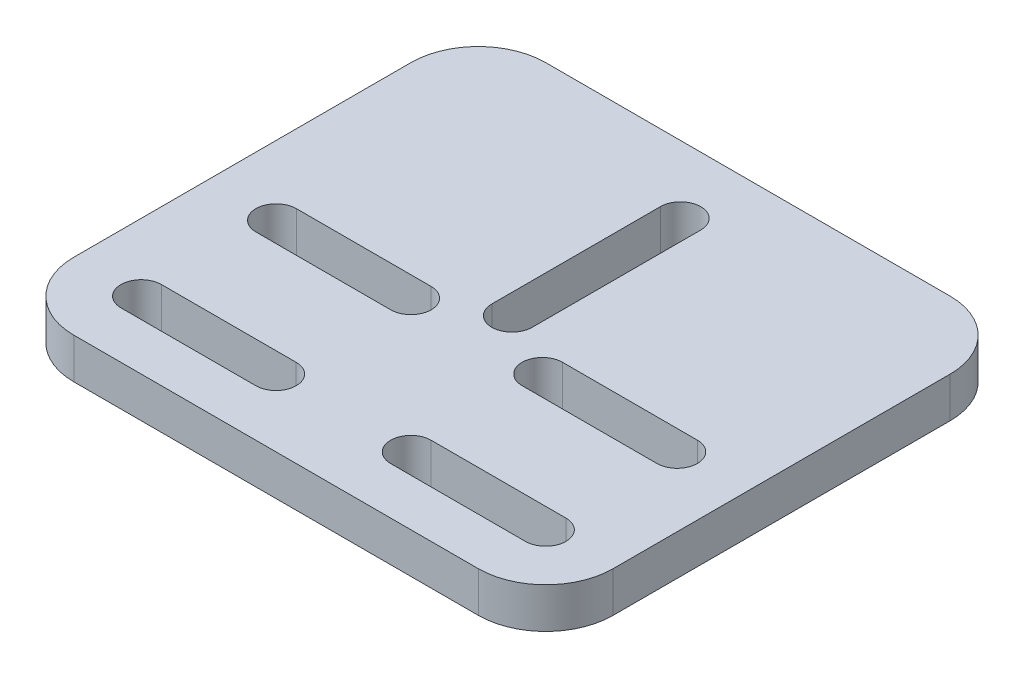
ISO-10303-21;
HEADER;
FILE_DESCRIPTION(('STEP AP214'),'2;1');
FILE_NAME('part.step','',(''),(''),'','','');
FILE_SCHEMA(('AUTOMOTIVE_DESIGN { 1 0 10303 214 1 1 1 1 }'));
ENDSEC;
DATA;
#1=APPLICATION_CONTEXT('core data for automotive mechanical design processes');
#2=APPLICATION_PROTOCOL_DEFINITION('international standard','automotive_design',2000,#1);
#3=PRODUCT_CONTEXT('',#1,'mechanical');
#4=PRODUCT('Part','Part','',(#3));
#5=PRODUCT_RELATED_PRODUCT_CATEGORY('part','',(#4));
#6=PRODUCT_DEFINITION_FORMATION('','',#4);
#7=PRODUCT_DEFINITION_CONTEXT('part definition',#1,'design');
#8=PRODUCT_DEFINITION('design','',#6,#7);
#9=PRODUCT_DEFINITION_SHAPE('','',#8);
#10=(LENGTH_UNIT() NAMED_UNIT(*) SI_UNIT(.MILLI.,.METRE.));
#11=(NAMED_UNIT(*) PLANE_ANGLE_UNIT() SI_UNIT($,.RADIAN.));
#12=(NAMED_UNIT(*) SI_UNIT($,.STERADIAN.) SOLID_ANGLE_UNIT());
#13=UNCERTAINTY_MEASURE_WITH_UNIT(LENGTH_MEASURE(1.E-05),#10,'distance_accuracy_value','');
#14=(GEOMETRIC_REPRESENTATION_CONTEXT(3) GLOBAL_UNCERTAINTY_ASSIGNED_CONTEXT((#13)) GLOBAL_UNIT_ASSIGNED_CONTEXT((#10,
#11,#12)) REPRESENTATION_CONTEXT('',''));
#15=CARTESIAN_POINT('',(0.,0.,0.));
#16=DIRECTION('',(0.,0.,1.));
#17=DIRECTION('',(1.,0.,0.));
#18=AXIS2_PLACEMENT_3D('',#15,#16,#17);
#19=CARTESIAN_POINT('',(0.,3.,4.12183837825092));
#20=DIRECTION('',(0.,0.,-1.));
#21=DIRECTION('',(-1.,0.,0.));
#22=AXIS2_PLACEMENT_3D('',#19,#20,#21);
#23=PLANE('',#22);
#24=DIRECTION('',(1.,0.,0.));
#25=VECTOR('',#24,1.);
#26=CARTESIAN_POINT('',(0.,0.,4.12183837825092));
#27=LINE('',#26,#25);
#28=CARTESIAN_POINT('',(4.86993639459578,0.,4.12183837825092));
#29=VERTEX_POINT('',#28);
#30=CARTESIAN_POINT('',(14.8699363945958,0.,4.12183837825092));
#31=VERTEX_POINT('',#30);
#32=EDGE_CURVE('E354',#29,#31,#27,.T.);
#33=ORIENTED_EDGE('',*,*,#32,.F.);
#34=DIRECTION('',(0.,-1.,0.));
#35=VECTOR('',#34,1.);
#36=CARTESIAN_POINT('',(4.86993639459578,3.,4.12183837825092));
#37=LINE('',#36,#35);
#38=CARTESIAN_POINT('',(4.86993639459578,3.,4.12183837825092));
#39=VERTEX_POINT('',#38);
#40=EDGE_CURVE('E11',#39,#29,#37,.T.);
#41=ORIENTED_EDGE('',*,*,#40,.F.);
#42=DIRECTION('',(1.,0.,0.));
#43=VECTOR('',#42,1.);
#44=CARTESIAN_POINT('',(0.,3.,4.12183837825092));
#45=LINE('',#44,#43);
#46=CARTESIAN_POINT('',(14.8699363945958,3.,4.12183837825092));
#47=VERTEX_POINT('',#46);
#48=EDGE_CURVE('E241',#39,#47,#45,.T.);
#49=ORIENTED_EDGE('',*,*,#48,.T.);
#50=DIRECTION('',(0.,-1.,0.));
#51=VECTOR('',#50,1.);
#52=CARTESIAN_POINT('',(14.8699363945958,3.,4.12183837825092));
#53=LINE('',#52,#51);
#54=EDGE_CURVE('E155',#47,#31,#53,.T.);
#55=ORIENTED_EDGE('',*,*,#54,.T.);
#56=EDGE_LOOP('',(#33,#41,#49,#55));
#57=FACE_BOUND('',#56,.T.);
#58=ADVANCED_FACE('F41',(#57),#23,.T.);
#59=CARTESIAN_POINT('',(4.86993639459578,3.,2.62183837825092));
#60=DIRECTION('',(0.,-1.,0.));
#61=DIRECTION('',(0.,0.,-1.));
#62=AXIS2_PLACEMENT_3D('',#59,#60,#61);
#63=CYLINDRICAL_SURFACE('',#62,1.5);
#64=CARTESIAN_POINT('',(4.86993639459578,0.,2.62183837825092));
#65=DIRECTION('',(0.,1.,0.));
#66=DIRECTION('',(0.,0.,1.));
#67=AXIS2_PLACEMENT_3D('',#64,#65,#66);
#68=CIRCLE('',#67,1.5);
#69=CARTESIAN_POINT('',(4.86993639459578,0.,1.12183837825092));
#70=VERTEX_POINT('',#69);
#71=EDGE_CURVE('E248',#29,#70,#68,.F.);
#72=ORIENTED_EDGE('',*,*,#71,.T.);
#73=DIRECTION('',(0.,-1.,0.));
#74=VECTOR('',#73,1.);
#75=CARTESIAN_POINT('',(4.86993639459578,3.,1.12183837825092));
#76=LINE('',#75,#74);
#77=CARTESIAN_POINT('',(4.86993639459578,3.,1.12183837825092));
#78=VERTEX_POINT('',#77);
#79=EDGE_CURVE('E52',#78,#70,#76,.T.);
#80=ORIENTED_EDGE('',*,*,#79,.F.);
#81=CARTESIAN_POINT('',(4.86993639459578,3.,2.62183837825092));
#82=DIRECTION('',(0.,1.,0.));
#83=DIRECTION('',(0.,0.,1.));
#84=AXIS2_PLACEMENT_3D('',#81,#82,#83);
#85=CIRCLE('',#84,1.5);
#86=EDGE_CURVE('E236',#39,#78,#85,.F.);
#87=ORIENTED_EDGE('',*,*,#86,.F.);
#88=ORIENTED_EDGE('',*,*,#40,.T.);
#89=EDGE_LOOP('',(#72,#80,#87,#88));
#90=FACE_BOUND('',#89,.T.);
#91=ADVANCED_FACE('F246',(#90),#63,.F.);
#92=CARTESIAN_POINT('',(0.,3.,1.12183837825092));
#93=DIRECTION('',(0.,0.,1.));
#94=DIRECTION('',(1.,0.,0.));
#95=AXIS2_PLACEMENT_3D('',#92,#93,#94);
#96=PLANE('',#95);
#97=DIRECTION('',(-1.,0.,0.));
#98=VECTOR('',#97,1.);
#99=CARTESIAN_POINT('',(0.,0.,1.12183837825092));
#100=LINE('',#99,#98);
#101=CARTESIAN_POINT('',(14.8699363945958,0.,1.12183837825092));
#102=VERTEX_POINT('',#101);
#103=EDGE_CURVE('E360',#102,#70,#100,.T.);
#104=ORIENTED_EDGE('',*,*,#103,.F.);
#105=DIRECTION('',(0.,-1.,0.));
#106=VECTOR('',#105,1.);
#107=CARTESIAN_POINT('',(14.8699363945958,3.,1.12183837825092));
#108=LINE('',#107,#106);
#109=CARTESIAN_POINT('',(14.8699363945958,3.,1.12183837825092));
#110=VERTEX_POINT('',#109);
#111=EDGE_CURVE('E148',#110,#102,#108,.T.);
#112=ORIENTED_EDGE('',*,*,#111,.F.);
#113=DIRECTION('',(-1.,0.,0.));
#114=VECTOR('',#113,1.);
#115=CARTESIAN_POINT('',(0.,3.,1.12183837825092));
#116=LINE('',#115,#114);
#117=EDGE_CURVE('E240',#110,#78,#116,.T.);
#118=ORIENTED_EDGE('',*,*,#117,.T.);
#119=ORIENTED_EDGE('',*,*,#79,.T.);
#120=EDGE_LOOP('',(#104,#112,#118,#119));
#121=FACE_BOUND('',#120,.T.);
#122=ADVANCED_FACE('F254',(#121),#96,.T.);
#123=CARTESIAN_POINT('',(0.,3.,14.));
#124=DIRECTION('',(0.,0.,-1.));
#125=DIRECTION('',(-1.,0.,0.));
#126=AXIS2_PLACEMENT_3D('',#123,#124,#125);
#127=PLANE('',#126);
#128=DIRECTION('',(1.,0.,0.));
#129=VECTOR('',#128,1.);
#130=CARTESIAN_POINT('',(0.,0.,14.));
#131=LINE('',#130,#129);
#132=CARTESIAN_POINT('',(-15.,0.,14.));
#133=VERTEX_POINT('',#132);
#134=CARTESIAN_POINT('',(-4.99999999999999,0.,14.));
#135=VERTEX_POINT('',#134);
#136=EDGE_CURVE('E338',#133,#135,#131,.T.);
#137=ORIENTED_EDGE('',*,*,#136,.F.);
#138=DIRECTION('',(0.,-1.,0.));
#139=VECTOR('',#138,1.);
#140=CARTESIAN_POINT('',(-15.,3.,14.));
#141=LINE('',#140,#139);
#142=CARTESIAN_POINT('',(-15.,3.,14.));
#143=VERTEX_POINT('',#142);
#144=EDGE_CURVE('E369',#143,#133,#141,.T.);
#145=ORIENTED_EDGE('',*,*,#144,.F.);
#146=DIRECTION('',(1.,0.,0.));
#147=VECTOR('',#146,1.);
#148=CARTESIAN_POINT('',(0.,3.,14.));
#149=LINE('',#148,#147);
#150=CARTESIAN_POINT('',(-4.99999999999999,3.,14.));
#151=VERTEX_POINT('',#150);
#152=EDGE_CURVE('E529',#143,#151,#149,.T.);
#153=ORIENTED_EDGE('',*,*,#152,.T.);
#154=DIRECTION('',(0.,-1.,0.));
#155=VECTOR('',#154,1.);
#156=CARTESIAN_POINT('',(-4.99999999999999,3.,14.));
#157=LINE('',#156,#155);
#158=EDGE_CURVE('E372',#151,#135,#157,.T.);
#159=ORIENTED_EDGE('',*,*,#158,.T.);
#160=EDGE_LOOP('',(#137,#145,#153,#159));
#161=FACE_BOUND('',#160,.T.);
#162=ADVANCED_FACE('F579',(#161),#127,.T.);
#163=CARTESIAN_POINT('',(-15.,3.,12.5));
#164=DIRECTION('',(0.,-1.,0.));
#165=DIRECTION('',(0.,0.,-1.));
#166=AXIS2_PLACEMENT_3D('',#163,#164,#165);
#167=CYLINDRICAL_SURFACE('',#166,1.5);
#168=CARTESIAN_POINT('',(-15.,0.,12.5));
#169=DIRECTION('',(0.,1.,0.));
#170=DIRECTION('',(0.,0.,1.));
#171=AXIS2_PLACEMENT_3D('',#168,#169,#170);
#172=CIRCLE('',#171,1.5);
#173=CARTESIAN_POINT('',(-15.,0.,11.));
#174=VERTEX_POINT('',#173);
#175=EDGE_CURVE('E342',#133,#174,#172,.F.);
#176=ORIENTED_EDGE('',*,*,#175,.T.);
#177=DIRECTION('',(0.,-1.,0.));
#178=VECTOR('',#177,1.);
#179=CARTESIAN_POINT('',(-15.,3.,11.));
#180=LINE('',#179,#178);
#181=CARTESIAN_POINT('',(-15.,3.,11.));
#182=VERTEX_POINT('',#181);
#183=EDGE_CURVE('E379',#182,#174,#180,.T.);
#184=ORIENTED_EDGE('',*,*,#183,.F.);
#185=CARTESIAN_POINT('',(-15.,3.,12.5));
#186=DIRECTION('',(0.,1.,0.));
#187=DIRECTION('',(0.,0.,1.));
#188=AXIS2_PLACEMENT_3D('',#185,#186,#187);
#189=CIRCLE('',#188,1.5);
#190=EDGE_CURVE('E533',#143,#182,#189,.F.);
#191=ORIENTED_EDGE('',*,*,#190,.F.);
#192=ORIENTED_EDGE('',*,*,#144,.T.);
#193=EDGE_LOOP('',(#176,#184,#191,#192));
#194=FACE_BOUND('',#193,.T.);
#195=ADVANCED_FACE('F575',(#194),#167,.F.);
#196=CARTESIAN_POINT('',(0.,3.,11.));
#197=DIRECTION('',(0.,0.,1.));
#198=DIRECTION('',(1.,0.,0.));
#199=AXIS2_PLACEMENT_3D('',#196,#197,#198);
#200=PLANE('',#199);
#201=DIRECTION('',(-1.,0.,0.));
#202=VECTOR('',#201,1.);
#203=CARTESIAN_POINT('',(0.,0.,11.));
#204=LINE('',#203,#202);
#205=CARTESIAN_POINT('',(-4.99999999999999,0.,11.));
#206=VERTEX_POINT('',#205);
#207=EDGE_CURVE('E346',#206,#174,#204,.T.);
#208=ORIENTED_EDGE('',*,*,#207,.F.);
#209=DIRECTION('',(0.,-1.,0.));
#210=VECTOR('',#209,1.);
#211=CARTESIAN_POINT('',(-4.99999999999999,3.,11.));
#212=LINE('',#211,#210);
#213=CARTESIAN_POINT('',(-4.99999999999999,3.,11.));
#214=VERTEX_POINT('',#213);
#215=EDGE_CURVE('E375',#214,#206,#212,.T.);
#216=ORIENTED_EDGE('',*,*,#215,.F.);
#217=DIRECTION('',(-1.,0.,0.));
#218=VECTOR('',#217,1.);
#219=CARTESIAN_POINT('',(0.,3.,11.));
#220=LINE('',#219,#218);
#221=EDGE_CURVE('E536',#214,#182,#220,.T.);
#222=ORIENTED_EDGE('',*,*,#221,.T.);
#223=ORIENTED_EDGE('',*,*,#183,.T.);
#224=EDGE_LOOP('',(#208,#216,#222,#223));
#225=FACE_BOUND('',#224,.T.);
#226=ADVANCED_FACE('F571',(#225),#200,.T.);
#227=CARTESIAN_POINT('',(4.99999999999999,3.,12.5));
#228=DIRECTION('',(0.,-1.,0.));
#229=DIRECTION('',(0.,0.,-1.));
#230=AXIS2_PLACEMENT_3D('',#227,#228,#229);
#231=CYLINDRICAL_SURFACE('',#230,1.5);
#232=CARTESIAN_POINT('',(4.99999999999999,0.,12.5));
#233=DIRECTION('',(0.,1.,0.));
#234=DIRECTION('',(0.,0.,1.));
#235=AXIS2_PLACEMENT_3D('',#232,#233,#234);
#236=CIRCLE('',#235,1.5);
#237=CARTESIAN_POINT('',(4.99999999999999,0.,11.));
#238=VERTEX_POINT('',#237);
#239=CARTESIAN_POINT('',(4.99999999999999,0.,14.));
#240=VERTEX_POINT('',#239);
#241=EDGE_CURVE('E322',#238,#240,#236,.T.);
#242=ORIENTED_EDGE('',*,*,#241,.F.);
#243=DIRECTION('',(0.,-1.,0.));
#244=VECTOR('',#243,1.);
#245=CARTESIAN_POINT('',(4.99999999999999,3.,11.));
#246=LINE('',#245,#244);
#247=CARTESIAN_POINT('',(4.99999999999999,3.,11.));
#248=VERTEX_POINT('',#247);
#249=EDGE_CURVE('E376',#248,#238,#246,.T.);
#250=ORIENTED_EDGE('',*,*,#249,.F.);
#251=CARTESIAN_POINT('',(4.99999999999999,3.,12.5));
#252=DIRECTION('',(0.,1.,0.));
#253=DIRECTION('',(0.,0.,1.));
#254=AXIS2_PLACEMENT_3D('',#251,#252,#253);
#255=CIRCLE('',#254,1.5);
#256=CARTESIAN_POINT('',(4.99999999999999,3.,14.));
#257=VERTEX_POINT('',#256);
#258=EDGE_CURVE('E515',#248,#257,#255,.T.);
#259=ORIENTED_EDGE('',*,*,#258,.T.);
#260=DIRECTION('',(0.,-1.,0.));
#261=VECTOR('',#260,1.);
#262=CARTESIAN_POINT('',(4.99999999999999,3.,14.));
#263=LINE('',#262,#261);
#264=EDGE_CURVE('E384',#257,#240,#263,.T.);
#265=ORIENTED_EDGE('',*,*,#264,.T.);
#266=EDGE_LOOP('',(#242,#250,#259,#265));
#267=FACE_BOUND('',#266,.T.);
#268=ADVANCED_FACE('F574',(#267),#231,.F.);
#269=CARTESIAN_POINT('',(0.,3.,11.));
#270=DIRECTION('',(0.,0.,-1.));
#271=DIRECTION('',(-1.,0.,0.));
#272=AXIS2_PLACEMENT_3D('',#269,#270,#271);
#273=PLANE('',#272);
#274=DIRECTION('',(1.,0.,0.));
#275=VECTOR('',#274,1.);
#276=CARTESIAN_POINT('',(0.,0.,11.));
#277=LINE('',#276,#275);
#278=CARTESIAN_POINT('',(15.,0.,11.));
#279=VERTEX_POINT('',#278);
#280=EDGE_CURVE('E326',#238,#279,#277,.T.);
#281=ORIENTED_EDGE('',*,*,#280,.T.);
#282=DIRECTION('',(0.,-1.,0.));
#283=VECTOR('',#282,1.);
#284=CARTESIAN_POINT('',(15.,3.,11.));
#285=LINE('',#284,#283);
#286=CARTESIAN_POINT('',(15.,3.,11.));
#287=VERTEX_POINT('',#286);
#288=EDGE_CURVE('E391',#287,#279,#285,.T.);
#289=ORIENTED_EDGE('',*,*,#288,.F.);
#290=DIRECTION('',(1.,0.,0.));
#291=VECTOR('',#290,1.);
#292=CARTESIAN_POINT('',(0.,3.,11.));
#293=LINE('',#292,#291);
#294=EDGE_CURVE('E519',#248,#287,#293,.T.);
#295=ORIENTED_EDGE('',*,*,#294,.F.);
#296=ORIENTED_EDGE('',*,*,#249,.T.);
#297=EDGE_LOOP('',(#281,#289,#295,#296));
#298=FACE_BOUND('',#297,.T.);
#299=ADVANCED_FACE('F592',(#298),#273,.F.);
#300=CARTESIAN_POINT('',(15.,3.,12.5));
#301=DIRECTION('',(0.,-1.,0.));
#302=DIRECTION('',(0.,0.,-1.));
#303=AXIS2_PLACEMENT_3D('',#300,#301,#302);
#304=CYLINDRICAL_SURFACE('',#303,1.5);
#305=CARTESIAN_POINT('',(15.,0.,12.5));
#306=DIRECTION('',(0.,1.,0.));
#307=DIRECTION('',(0.,0.,1.));
#308=AXIS2_PLACEMENT_3D('',#305,#306,#307);
#309=CIRCLE('',#308,1.5);
#310=CARTESIAN_POINT('',(15.,0.,14.));
#311=VERTEX_POINT('',#310);
#312=EDGE_CURVE('E330',#311,#279,#309,.T.);
#313=ORIENTED_EDGE('',*,*,#312,.F.);
#314=DIRECTION('',(0.,-1.,0.));
#315=VECTOR('',#314,1.);
#316=CARTESIAN_POINT('',(15.,3.,14.));
#317=LINE('',#316,#315);
#318=CARTESIAN_POINT('',(15.,3.,14.));
#319=VERTEX_POINT('',#318);
#320=EDGE_CURVE('E387',#319,#311,#317,.T.);
#321=ORIENTED_EDGE('',*,*,#320,.F.);
#322=CARTESIAN_POINT('',(15.,3.,12.5));
#323=DIRECTION('',(0.,1.,0.));
#324=DIRECTION('',(0.,0.,1.));
#325=AXIS2_PLACEMENT_3D('',#322,#323,#324);
#326=CIRCLE('',#325,1.5);
#327=EDGE_CURVE('E522',#319,#287,#326,.T.);
#328=ORIENTED_EDGE('',*,*,#327,.T.);
#329=ORIENTED_EDGE('',*,*,#288,.T.);
#330=EDGE_LOOP('',(#313,#321,#328,#329));
#331=FACE_BOUND('',#330,.T.);
#332=ADVANCED_FACE('F588',(#331),#304,.F.);
#333=CARTESIAN_POINT('',(-4.86993639459578,3.,2.62183837825092));
#334=DIRECTION('',(0.,-1.,0.));
#335=DIRECTION('',(0.,0.,-1.));
#336=AXIS2_PLACEMENT_3D('',#333,#334,#335);
#337=CYLINDRICAL_SURFACE('',#336,1.5);
#338=CARTESIAN_POINT('',(-4.86993639459578,0.,2.62183837825092));
#339=DIRECTION('',(0.,1.,0.));
#340=DIRECTION('',(0.,0.,1.));
#341=AXIS2_PLACEMENT_3D('',#338,#339,#340);
#342=CIRCLE('',#341,1.5);
#343=CARTESIAN_POINT('',(-4.86993639459578,0.,4.12183837825092));
#344=VERTEX_POINT('',#343);
#345=CARTESIAN_POINT('',(-4.86993639459578,0.,1.12183837825092));
#346=VERTEX_POINT('',#345);
#347=EDGE_CURVE('E306',#344,#346,#342,.T.);
#348=ORIENTED_EDGE('',*,*,#347,.F.);
#349=DIRECTION('',(0.,-1.,0.));
#350=VECTOR('',#349,1.);
#351=CARTESIAN_POINT('',(-4.86993639459578,3.,4.12183837825092));
#352=LINE('',#351,#350);
#353=CARTESIAN_POINT('',(-4.86993639459578,3.,4.12183837825092));
#354=VERTEX_POINT('',#353);
#355=EDGE_CURVE('E388',#354,#344,#352,.T.);
#356=ORIENTED_EDGE('',*,*,#355,.F.);
#357=CARTESIAN_POINT('',(-4.86993639459578,3.,2.62183837825092));
#358=DIRECTION('',(0.,1.,0.));
#359=DIRECTION('',(0.,0.,1.));
#360=AXIS2_PLACEMENT_3D('',#357,#358,#359);
#361=CIRCLE('',#360,1.5);
#362=CARTESIAN_POINT('',(-4.86993639459578,3.,1.12183837825092));
#363=VERTEX_POINT('',#362);
#364=EDGE_CURVE('E501',#354,#363,#361,.T.);
#365=ORIENTED_EDGE('',*,*,#364,.T.);
#366=DIRECTION('',(0.,-1.,0.));
#367=VECTOR('',#366,1.);
#368=CARTESIAN_POINT('',(-4.86993639459578,3.,1.12183837825092));
#369=LINE('',#368,#367);
#370=EDGE_CURVE('E396',#363,#346,#369,.T.);
#371=ORIENTED_EDGE('',*,*,#370,.T.);
#372=EDGE_LOOP('',(#348,#356,#365,#371));
#373=FACE_BOUND('',#372,.T.);
#374=ADVANCED_FACE('F591',(#373),#337,.F.);
#375=CARTESIAN_POINT('',(0.,3.,4.12183837825092));
#376=DIRECTION('',(0.,0.,1.));
#377=DIRECTION('',(1.,0.,0.));
#378=AXIS2_PLACEMENT_3D('',#375,#376,#377);
#379=PLANE('',#378);
#380=DIRECTION('',(-1.,0.,0.));
#381=VECTOR('',#380,1.);
#382=CARTESIAN_POINT('',(0.,0.,4.12183837825092));
#383=LINE('',#382,#381);
#384=CARTESIAN_POINT('',(-14.8699363945958,0.,4.12183837825092));
#385=VERTEX_POINT('',#384);
#386=EDGE_CURVE('E310',#344,#385,#383,.T.);
#387=ORIENTED_EDGE('',*,*,#386,.T.);
#388=DIRECTION('',(0.,-1.,0.));
#389=VECTOR('',#388,1.);
#390=CARTESIAN_POINT('',(-14.8699363945958,3.,4.12183837825092));
#391=LINE('',#390,#389);
#392=CARTESIAN_POINT('',(-14.8699363945958,3.,4.12183837825092));
#393=VERTEX_POINT('',#392);
#394=EDGE_CURVE('E403',#393,#385,#391,.T.);
#395=ORIENTED_EDGE('',*,*,#394,.F.);
#396=DIRECTION('',(-1.,0.,0.));
#397=VECTOR('',#396,1.);
#398=CARTESIAN_POINT('',(0.,3.,4.12183837825092));
#399=LINE('',#398,#397);
#400=EDGE_CURVE('E505',#354,#393,#399,.T.);
#401=ORIENTED_EDGE('',*,*,#400,.F.);
#402=ORIENTED_EDGE('',*,*,#355,.T.);
#403=EDGE_LOOP('',(#387,#395,#401,#402));
#404=FACE_BOUND('',#403,.T.);
#405=ADVANCED_FACE('F607',(#404),#379,.F.);
#406=CARTESIAN_POINT('',(-14.8699363945958,3.,2.62183837825092));
#407=DIRECTION('',(0.,-1.,0.));
#408=DIRECTION('',(0.,0.,-1.));
#409=AXIS2_PLACEMENT_3D('',#406,#407,#408);
#410=CYLINDRICAL_SURFACE('',#409,1.5);
#411=CARTESIAN_POINT('',(-14.8699363945958,0.,2.62183837825092));
#412=DIRECTION('',(0.,1.,0.));
#413=DIRECTION('',(0.,0.,1.));
#414=AXIS2_PLACEMENT_3D('',#411,#412,#413);
#415=CIRCLE('',#414,1.5);
#416=CARTESIAN_POINT('',(-14.8699363945958,0.,1.12183837825092));
#417=VERTEX_POINT('',#416);
#418=EDGE_CURVE('E314',#417,#385,#415,.T.);
#419=ORIENTED_EDGE('',*,*,#418,.F.);
#420=DIRECTION('',(0.,-1.,0.));
#421=VECTOR('',#420,1.);
#422=CARTESIAN_POINT('',(-14.8699363945958,3.,1.12183837825092));
#423=LINE('',#422,#421);
#424=CARTESIAN_POINT('',(-14.8699363945958,3.,1.12183837825092));
#425=VERTEX_POINT('',#424);
#426=EDGE_CURVE('E399',#425,#417,#423,.T.);
#427=ORIENTED_EDGE('',*,*,#426,.F.);
#428=CARTESIAN_POINT('',(-14.8699363945958,3.,2.62183837825092));
#429=DIRECTION('',(0.,1.,0.));
#430=DIRECTION('',(0.,0.,1.));
#431=AXIS2_PLACEMENT_3D('',#428,#429,#430);
#432=CIRCLE('',#431,1.5);
#433=EDGE_CURVE('E508',#425,#393,#432,.T.);
#434=ORIENTED_EDGE('',*,*,#433,.T.);
#435=ORIENTED_EDGE('',*,*,#394,.T.);
#436=EDGE_LOOP('',(#419,#427,#434,#435));
#437=FACE_BOUND('',#436,.T.);
#438=ADVANCED_FACE('F603',(#437),#410,.F.);
#439=CARTESIAN_POINT('',(0.,3.,0.));
#440=DIRECTION('',(0.,-1.,0.));
#441=DIRECTION('',(0.,0.,-1.));
#442=AXIS2_PLACEMENT_3D('',#439,#440,#441);
#443=CYLINDRICAL_SURFACE('',#442,1.5);
#444=CARTESIAN_POINT('',(0.,0.,0.));
#445=DIRECTION('',(0.,1.,0.));
#446=DIRECTION('',(0.,0.,1.));
#447=AXIS2_PLACEMENT_3D('',#444,#445,#446);
#448=CIRCLE('',#447,1.5);
#449=CARTESIAN_POINT('',(-1.5,0.,0.));
#450=VERTEX_POINT('',#449);
#451=CARTESIAN_POINT('',(1.5,0.,0.));
#452=VERTEX_POINT('',#451);
#453=EDGE_CURVE('E290',#450,#452,#448,.T.);
#454=ORIENTED_EDGE('',*,*,#453,.F.);
#455=DIRECTION('',(0.,-1.,0.));
#456=VECTOR('',#455,1.);
#457=CARTESIAN_POINT('',(-1.5,3.,0.));
#458=LINE('',#457,#456);
#459=CARTESIAN_POINT('',(-1.5,3.,0.));
#460=VERTEX_POINT('',#459);
#461=EDGE_CURVE('E400',#460,#450,#458,.T.);
#462=ORIENTED_EDGE('',*,*,#461,.F.);
#463=CARTESIAN_POINT('',(0.,3.,0.));
#464=DIRECTION('',(0.,1.,0.));
#465=DIRECTION('',(0.,0.,1.));
#466=AXIS2_PLACEMENT_3D('',#463,#464,#465);
#467=CIRCLE('',#466,1.5);
#468=CARTESIAN_POINT('',(1.5,3.,0.));
#469=VERTEX_POINT('',#468);
#470=EDGE_CURVE('E486',#460,#469,#467,.T.);
#471=ORIENTED_EDGE('',*,*,#470,.T.);
#472=DIRECTION('',(0.,-1.,0.));
#473=VECTOR('',#472,1.);
#474=CARTESIAN_POINT('',(1.5,3.,0.));
#475=LINE('',#474,#473);
#476=EDGE_CURVE('E408',#469,#452,#475,.T.);
#477=ORIENTED_EDGE('',*,*,#476,.T.);
#478=EDGE_LOOP('',(#454,#462,#471,#477));
#479=FACE_BOUND('',#478,.T.);
#480=ADVANCED_FACE('F606',(#479),#443,.F.);
#481=CARTESIAN_POINT('',(-1.5,3.,0.));
#482=DIRECTION('',(1.,0.,0.));
#483=DIRECTION('',(0.,0.,-1.));
#484=AXIS2_PLACEMENT_3D('',#481,#482,#483);
#485=PLANE('',#484);
#486=DIRECTION('',(0.,0.,1.));
#487=VECTOR('',#486,1.);
#488=CARTESIAN_POINT('',(-1.5,0.,0.));
#489=LINE('',#488,#487);
#490=CARTESIAN_POINT('',(-1.5,0.,-12.5));
#491=VERTEX_POINT('',#490);
#492=EDGE_CURVE('E294',#491,#450,#489,.T.);
#493=ORIENTED_EDGE('',*,*,#492,.F.);
#494=DIRECTION('',(0.,-1.,0.));
#495=VECTOR('',#494,1.);
#496=CARTESIAN_POINT('',(-1.5,3.,-12.5));
#497=LINE('',#496,#495);
#498=CARTESIAN_POINT('',(-1.5,3.,-12.5));
#499=VERTEX_POINT('',#498);
#500=EDGE_CURVE('E414',#499,#491,#497,.T.);
#501=ORIENTED_EDGE('',*,*,#500,.F.);
#502=DIRECTION('',(0.,0.,1.));
#503=VECTOR('',#502,1.);
#504=CARTESIAN_POINT('',(-1.5,3.,0.));
#505=LINE('',#504,#503);
#506=EDGE_CURVE('E490',#499,#460,#505,.T.);
#507=ORIENTED_EDGE('',*,*,#506,.T.);
#508=ORIENTED_EDGE('',*,*,#461,.T.);
#509=EDGE_LOOP('',(#493,#501,#507,#508));
#510=FACE_BOUND('',#509,.T.);
#511=ADVANCED_FACE('F621',(#510),#485,.T.);
#512=CARTESIAN_POINT('',(0.,3.,-12.5));
#513=DIRECTION('',(0.,-1.,0.));
#514=DIRECTION('',(0.,0.,-1.));
#515=AXIS2_PLACEMENT_3D('',#512,#513,#514);
#516=CYLINDRICAL_SURFACE('',#515,1.5);
#517=CARTESIAN_POINT('',(0.,0.,-12.5));
#518=DIRECTION('',(0.,1.,0.));
#519=DIRECTION('',(0.,0.,1.));
#520=AXIS2_PLACEMENT_3D('',#517,#518,#519);
#521=CIRCLE('',#520,1.5);
#522=CARTESIAN_POINT('',(1.5,0.,-12.5));
#523=VERTEX_POINT('',#522);
#524=EDGE_CURVE('E298',#523,#491,#521,.T.);
#525=ORIENTED_EDGE('',*,*,#524,.F.);
#526=DIRECTION('',(0.,-1.,0.));
#527=VECTOR('',#526,1.);
#528=CARTESIAN_POINT('',(1.5,3.,-12.5));
#529=LINE('',#528,#527);
#530=CARTESIAN_POINT('',(1.5,3.,-12.5));
#531=VERTEX_POINT('',#530);
#532=EDGE_CURVE('E411',#531,#523,#529,.T.);
#533=ORIENTED_EDGE('',*,*,#532,.F.);
#534=CARTESIAN_POINT('',(0.,3.,-12.5));
#535=DIRECTION('',(0.,1.,0.));
#536=DIRECTION('',(0.,0.,1.));
#537=AXIS2_PLACEMENT_3D('',#534,#535,#536);
#538=CIRCLE('',#537,1.5);
#539=EDGE_CURVE('E494',#531,#499,#538,.T.);
#540=ORIENTED_EDGE('',*,*,#539,.T.);
#541=ORIENTED_EDGE('',*,*,#500,.T.);
#542=EDGE_LOOP('',(#525,#533,#540,#541));
#543=FACE_BOUND('',#542,.T.);
#544=ADVANCED_FACE('F618',(#543),#516,.F.);
#545=CARTESIAN_POINT('',(15.,3.,-12.5));
#546=DIRECTION('',(0.,-1.,0.));
#547=DIRECTION('',(0.,0.,-1.));
#548=AXIS2_PLACEMENT_3D('',#545,#546,#547);
#549=CYLINDRICAL_SURFACE('',#548,5.);
#550=CARTESIAN_POINT('',(15.,0.,-12.5));
#551=DIRECTION('',(0.,1.,0.));
#552=DIRECTION('',(0.,0.,1.));
#553=AXIS2_PLACEMENT_3D('',#550,#551,#552);
#554=CIRCLE('',#553,5.);
#555=CARTESIAN_POINT('',(15.,0.,-17.5));
#556=VERTEX_POINT('',#555);
#557=CARTESIAN_POINT('',(20.,0.,-12.5));
#558=VERTEX_POINT('',#557);
#559=EDGE_CURVE('E262',#556,#558,#554,.F.);
#560=ORIENTED_EDGE('',*,*,#559,.F.);
#561=DIRECTION('',(0.,-1.,0.));
#562=VECTOR('',#561,1.);
#563=CARTESIAN_POINT('',(15.,3.,-17.5));
#564=LINE('',#563,#562);
#565=CARTESIAN_POINT('',(15.,3.,-17.5));
#566=VERTEX_POINT('',#565);
#567=EDGE_CURVE('E45',#566,#556,#564,.T.);
#568=ORIENTED_EDGE('',*,*,#567,.F.);
#569=CARTESIAN_POINT('',(15.,3.,-12.5));
#570=DIRECTION('',(0.,1.,0.));
#571=DIRECTION('',(0.,0.,1.));
#572=AXIS2_PLACEMENT_3D('',#569,#570,#571);
#573=CIRCLE('',#572,5.);
#574=CARTESIAN_POINT('',(20.,3.,-12.5));
#575=VERTEX_POINT('',#574);
#576=EDGE_CURVE('E366',#566,#575,#573,.F.);
#577=ORIENTED_EDGE('',*,*,#576,.T.);
#578=DIRECTION('',(0.,-1.,0.));
#579=VECTOR('',#578,1.);
#580=CARTESIAN_POINT('',(20.,3.,-12.5));
#581=LINE('',#580,#579);
#582=EDGE_CURVE('E258',#575,#558,#581,.T.);
#583=ORIENTED_EDGE('',*,*,#582,.T.);
#584=EDGE_LOOP('',(#560,#568,#577,#583));
#585=FACE_BOUND('',#584,.T.);
#586=ADVANCED_FACE('F43',(#585),#549,.T.);
#587=CARTESIAN_POINT('',(0.,3.,-17.5));
#588=DIRECTION('',(0.,0.,-1.));
#589=DIRECTION('',(-1.,0.,0.));
#590=AXIS2_PLACEMENT_3D('',#587,#588,#589);
#591=PLANE('',#590);
#592=DIRECTION('',(1.,0.,0.));
#593=VECTOR('',#592,1.);
#594=CARTESIAN_POINT('',(0.,0.,-17.5));
#595=LINE('',#594,#593);
#596=CARTESIAN_POINT('',(-15.,0.,-17.5));
#597=VERTEX_POINT('',#596);
#598=EDGE_CURVE('E266',#597,#556,#595,.T.);
#599=ORIENTED_EDGE('',*,*,#598,.F.);
#600=DIRECTION('',(0.,-1.,0.));
#601=VECTOR('',#600,1.);
#602=CARTESIAN_POINT('',(-15.,3.,-17.5));
#603=LINE('',#602,#601);
#604=CARTESIAN_POINT('',(-15.,3.,-17.5));
#605=VERTEX_POINT('',#604);
#606=EDGE_CURVE('E439',#605,#597,#603,.T.);
#607=ORIENTED_EDGE('',*,*,#606,.F.);
#608=DIRECTION('',(1.,0.,0.));
#609=VECTOR('',#608,1.);
#610=CARTESIAN_POINT('',(0.,3.,-17.5));
#611=LINE('',#610,#609);
#612=EDGE_CURVE('E450',#605,#566,#611,.T.);
#613=ORIENTED_EDGE('',*,*,#612,.T.);
#614=ORIENTED_EDGE('',*,*,#567,.T.);
#615=EDGE_LOOP('',(#599,#607,#613,#614));
#616=FACE_BOUND('',#615,.T.);
#617=ADVANCED_FACE('F448',(#616),#591,.T.);
#618=CARTESIAN_POINT('',(-15.,3.,-12.5));
#619=DIRECTION('',(0.,-1.,0.));
#620=DIRECTION('',(0.,0.,-1.));
#621=AXIS2_PLACEMENT_3D('',#618,#619,#620);
#622=CYLINDRICAL_SURFACE('',#621,5.);
#623=CARTESIAN_POINT('',(-15.,0.,-12.5));
#624=DIRECTION('',(0.,1.,0.));
#625=DIRECTION('',(0.,0.,1.));
#626=AXIS2_PLACEMENT_3D('',#623,#624,#625);
#627=CIRCLE('',#626,5.);
#628=CARTESIAN_POINT('',(-20.,0.,-12.5));
#629=VERTEX_POINT('',#628);
#630=EDGE_CURVE('E270',#597,#629,#627,.T.);
#631=ORIENTED_EDGE('',*,*,#630,.T.);
#632=DIRECTION('',(0.,-1.,0.));
#633=VECTOR('',#632,1.);
#634=CARTESIAN_POINT('',(-20.,3.,-12.5));
#635=LINE('',#634,#633);
#636=CARTESIAN_POINT('',(-20.,3.,-12.5));
#637=VERTEX_POINT('',#636);
#638=EDGE_CURVE('E436',#637,#629,#635,.T.);
#639=ORIENTED_EDGE('',*,*,#638,.F.);
#640=CARTESIAN_POINT('',(-15.,3.,-12.5));
#641=DIRECTION('',(0.,1.,0.));
#642=DIRECTION('',(0.,0.,1.));
#643=AXIS2_PLACEMENT_3D('',#640,#641,#642);
#644=CIRCLE('',#643,5.);
#645=EDGE_CURVE('E468',#605,#637,#644,.T.);
#646=ORIENTED_EDGE('',*,*,#645,.F.);
#647=ORIENTED_EDGE('',*,*,#606,.T.);
#648=EDGE_LOOP('',(#631,#639,#646,#647));
#649=FACE_BOUND('',#648,.T.);
#650=ADVANCED_FACE('F458',(#649),#622,.T.);
#651=CARTESIAN_POINT('',(-20.,3.,0.));
#652=DIRECTION('',(1.,0.,0.));
#653=DIRECTION('',(0.,0.,-1.));
#654=AXIS2_PLACEMENT_3D('',#651,#652,#653);
#655=PLANE('',#654);
#656=DIRECTION('',(0.,0.,1.));
#657=VECTOR('',#656,1.);
#658=CARTESIAN_POINT('',(-20.,0.,0.));
#659=LINE('',#658,#657);
#660=CARTESIAN_POINT('',(-20.,0.,12.5));
#661=VERTEX_POINT('',#660);
#662=EDGE_CURVE('E273',#629,#661,#659,.T.);
#663=ORIENTED_EDGE('',*,*,#662,.T.);
#664=DIRECTION('',(0.,-1.,0.));
#665=VECTOR('',#664,1.);
#666=CARTESIAN_POINT('',(-20.,3.,12.5));
#667=LINE('',#666,#665);
#668=CARTESIAN_POINT('',(-20.,3.,12.5));
#669=VERTEX_POINT('',#668);
#670=EDGE_CURVE('E432',#669,#661,#667,.T.);
#671=ORIENTED_EDGE('',*,*,#670,.F.);
#672=DIRECTION('',(0.,0.,1.));
#673=VECTOR('',#672,1.);
#674=CARTESIAN_POINT('',(-20.,3.,0.));
#675=LINE('',#674,#673);
#676=EDGE_CURVE('E463',#637,#669,#675,.T.);
#677=ORIENTED_EDGE('',*,*,#676,.F.);
#678=ORIENTED_EDGE('',*,*,#638,.T.);
#679=EDGE_LOOP('',(#663,#671,#677,#678));
#680=FACE_BOUND('',#679,.T.);
#681=ADVANCED_FACE('F461',(#680),#655,.F.);
#682=CARTESIAN_POINT('',(-15.,3.,12.5));
#683=DIRECTION('',(0.,-1.,0.));
#684=DIRECTION('',(0.,0.,-1.));
#685=AXIS2_PLACEMENT_3D('',#682,#683,#684);
#686=CYLINDRICAL_SURFACE('',#685,5.);
#687=CARTESIAN_POINT('',(-15.,0.,12.5));
#688=DIRECTION('',(0.,1.,0.));
#689=DIRECTION('',(0.,0.,1.));
#690=AXIS2_PLACEMENT_3D('',#687,#688,#689);
#691=CIRCLE('',#690,5.);
#692=CARTESIAN_POINT('',(-15.,0.,17.5));
#693=VERTEX_POINT('',#692);
#694=EDGE_CURVE('E276',#661,#693,#691,.T.);
#695=ORIENTED_EDGE('',*,*,#694,.T.);
#696=DIRECTION('',(0.,-1.,0.));
#697=VECTOR('',#696,1.);
#698=CARTESIAN_POINT('',(-15.,3.,17.5));
#699=LINE('',#698,#697);
#700=CARTESIAN_POINT('',(-15.,3.,17.5));
#701=VERTEX_POINT('',#700);
#702=EDGE_CURVE('E428',#701,#693,#699,.T.);
#703=ORIENTED_EDGE('',*,*,#702,.F.);
#704=CARTESIAN_POINT('',(-15.,3.,12.5));
#705=DIRECTION('',(0.,1.,0.));
#706=DIRECTION('',(0.,0.,1.));
#707=AXIS2_PLACEMENT_3D('',#704,#705,#706);
#708=CIRCLE('',#707,5.);
#709=EDGE_CURVE('E467',#669,#701,#708,.T.);
#710=ORIENTED_EDGE('',*,*,#709,.F.);
#711=ORIENTED_EDGE('',*,*,#670,.T.);
#712=EDGE_LOOP('',(#695,#703,#710,#711));
#713=FACE_BOUND('',#712,.T.);
#714=ADVANCED_FACE('F635',(#713),#686,.T.);
#715=CARTESIAN_POINT('',(0.,3.,17.5));
#716=DIRECTION('',(0.,0.,-1.));
#717=DIRECTION('',(-1.,0.,0.));
#718=AXIS2_PLACEMENT_3D('',#715,#716,#717);
#719=PLANE('',#718);
#720=DIRECTION('',(1.,0.,0.));
#721=VECTOR('',#720,1.);
#722=CARTESIAN_POINT('',(0.,0.,17.5));
#723=LINE('',#722,#721);
#724=CARTESIAN_POINT('',(15.,0.,17.5));
#725=VERTEX_POINT('',#724);
#726=EDGE_CURVE('E279',#693,#725,#723,.T.);
#727=ORIENTED_EDGE('',*,*,#726,.T.);
#728=DIRECTION('',(0.,-1.,0.));
#729=VECTOR('',#728,1.);
#730=CARTESIAN_POINT('',(15.,3.,17.5));
#731=LINE('',#730,#729);
#732=CARTESIAN_POINT('',(15.,3.,17.5));
#733=VERTEX_POINT('',#732);
#734=EDGE_CURVE('E424',#733,#725,#731,.T.);
#735=ORIENTED_EDGE('',*,*,#734,.F.);
#736=DIRECTION('',(1.,0.,0.));
#737=VECTOR('',#736,1.);
#738=CARTESIAN_POINT('',(0.,3.,17.5));
#739=LINE('',#738,#737);
#740=EDGE_CURVE('E472',#701,#733,#739,.T.);
#741=ORIENTED_EDGE('',*,*,#740,.F.);
#742=ORIENTED_EDGE('',*,*,#702,.T.);
#743=EDGE_LOOP('',(#727,#735,#741,#742));
#744=FACE_BOUND('',#743,.T.);
#745=ADVANCED_FACE('F631',(#744),#719,.F.);
#746=CARTESIAN_POINT('',(15.,3.,12.5));
#747=DIRECTION('',(0.,-1.,0.));
#748=DIRECTION('',(0.,0.,-1.));
#749=AXIS2_PLACEMENT_3D('',#746,#747,#748);
#750=CYLINDRICAL_SURFACE('',#749,5.);
#751=CARTESIAN_POINT('',(15.,0.,12.5));
#752=DIRECTION('',(0.,1.,0.));
#753=DIRECTION('',(0.,0.,1.));
#754=AXIS2_PLACEMENT_3D('',#751,#752,#753);
#755=CIRCLE('',#754,5.);
#756=CARTESIAN_POINT('',(20.,0.,12.5));
#757=VERTEX_POINT('',#756);
#758=EDGE_CURVE('E282',#725,#757,#755,.T.);
#759=ORIENTED_EDGE('',*,*,#758,.T.);
#760=DIRECTION('',(0.,-1.,0.));
#761=VECTOR('',#760,1.);
#762=CARTESIAN_POINT('',(20.,3.,12.5));
#763=LINE('',#762,#761);
#764=CARTESIAN_POINT('',(20.,3.,12.5));
#765=VERTEX_POINT('',#764);
#766=EDGE_CURVE('E421',#765,#757,#763,.T.);
#767=ORIENTED_EDGE('',*,*,#766,.F.);
#768=CARTESIAN_POINT('',(15.,3.,12.5));
#769=DIRECTION('',(0.,1.,0.));
#770=DIRECTION('',(0.,0.,1.));
#771=AXIS2_PLACEMENT_3D('',#768,#769,#770);
#772=CIRCLE('',#771,5.);
#773=EDGE_CURVE('E479',#733,#765,#772,.T.);
#774=ORIENTED_EDGE('',*,*,#773,.F.);
#775=ORIENTED_EDGE('',*,*,#734,.T.);
#776=EDGE_LOOP('',(#759,#767,#774,#775));
#777=FACE_BOUND('',#776,.T.);
#778=ADVANCED_FACE('F569',(#777),#750,.T.);
#779=CARTESIAN_POINT('',(-4.99999999999999,3.,12.5));
#780=DIRECTION('',(0.,-1.,0.));
#781=DIRECTION('',(0.,0.,-1.));
#782=AXIS2_PLACEMENT_3D('',#779,#780,#781);
#783=CYLINDRICAL_SURFACE('',#782,1.5);
#784=CARTESIAN_POINT('',(-4.99999999999999,0.,12.5));
#785=DIRECTION('',(0.,1.,0.));
#786=DIRECTION('',(0.,0.,1.));
#787=AXIS2_PLACEMENT_3D('',#784,#785,#786);
#788=CIRCLE('',#787,1.5);
#789=EDGE_CURVE('E350',#206,#135,#788,.F.);
#790=ORIENTED_EDGE('',*,*,#789,.T.);
#791=ORIENTED_EDGE('',*,*,#158,.F.);
#792=CARTESIAN_POINT('',(-4.99999999999999,3.,12.5));
#793=DIRECTION('',(0.,1.,0.));
#794=DIRECTION('',(0.,0.,1.));
#795=AXIS2_PLACEMENT_3D('',#792,#793,#794);
#796=CIRCLE('',#795,1.5);
#797=EDGE_CURVE('E540',#214,#151,#796,.F.);
#798=ORIENTED_EDGE('',*,*,#797,.F.);
#799=ORIENTED_EDGE('',*,*,#215,.T.);
#800=EDGE_LOOP('',(#790,#791,#798,#799));
#801=FACE_BOUND('',#800,.T.);
#802=ADVANCED_FACE('F565',(#801),#783,.F.);
#803=CARTESIAN_POINT('',(0.,3.,14.));
#804=DIRECTION('',(0.,0.,1.));
#805=DIRECTION('',(1.,0.,0.));
#806=AXIS2_PLACEMENT_3D('',#803,#804,#805);
#807=PLANE('',#806);
#808=DIRECTION('',(-1.,0.,0.));
#809=VECTOR('',#808,1.);
#810=CARTESIAN_POINT('',(0.,0.,14.));
#811=LINE('',#810,#809);
#812=EDGE_CURVE('E334',#311,#240,#811,.T.);
#813=ORIENTED_EDGE('',*,*,#812,.T.);
#814=ORIENTED_EDGE('',*,*,#264,.F.);
#815=DIRECTION('',(-1.,0.,0.));
#816=VECTOR('',#815,1.);
#817=CARTESIAN_POINT('',(0.,3.,14.));
#818=LINE('',#817,#816);
#819=EDGE_CURVE('E526',#319,#257,#818,.T.);
#820=ORIENTED_EDGE('',*,*,#819,.F.);
#821=ORIENTED_EDGE('',*,*,#320,.T.);
#822=EDGE_LOOP('',(#813,#814,#820,#821));
#823=FACE_BOUND('',#822,.T.);
#824=ADVANCED_FACE('F568',(#823),#807,.F.);
#825=CARTESIAN_POINT('',(0.,3.,1.12183837825092));
#826=DIRECTION('',(0.,0.,-1.));
#827=DIRECTION('',(-1.,0.,0.));
#828=AXIS2_PLACEMENT_3D('',#825,#826,#827);
#829=PLANE('',#828);
#830=DIRECTION('',(1.,0.,0.));
#831=VECTOR('',#830,1.);
#832=CARTESIAN_POINT('',(0.,0.,1.12183837825092));
#833=LINE('',#832,#831);
#834=EDGE_CURVE('E318',#417,#346,#833,.T.);
#835=ORIENTED_EDGE('',*,*,#834,.T.);
#836=ORIENTED_EDGE('',*,*,#370,.F.);
#837=DIRECTION('',(1.,0.,0.));
#838=VECTOR('',#837,1.);
#839=CARTESIAN_POINT('',(0.,3.,1.12183837825092));
#840=LINE('',#839,#838);
#841=EDGE_CURVE('E512',#425,#363,#840,.T.);
#842=ORIENTED_EDGE('',*,*,#841,.F.);
#843=ORIENTED_EDGE('',*,*,#426,.T.);
#844=EDGE_LOOP('',(#835,#836,#842,#843));
#845=FACE_BOUND('',#844,.T.);
#846=ADVANCED_FACE('F586',(#845),#829,.F.);
#847=CARTESIAN_POINT('',(1.5,3.,0.));
#848=DIRECTION('',(1.,0.,0.));
#849=DIRECTION('',(0.,0.,-1.));
#850=AXIS2_PLACEMENT_3D('',#847,#848,#849);
#851=PLANE('',#850);
#852=DIRECTION('',(0.,0.,1.));
#853=VECTOR('',#852,1.);
#854=CARTESIAN_POINT('',(1.5,0.,0.));
#855=LINE('',#854,#853);
#856=EDGE_CURVE('E302',#523,#452,#855,.T.);
#857=ORIENTED_EDGE('',*,*,#856,.T.);
#858=ORIENTED_EDGE('',*,*,#476,.F.);
#859=DIRECTION('',(0.,0.,1.));
#860=VECTOR('',#859,1.);
#861=CARTESIAN_POINT('',(1.5,3.,0.));
#862=LINE('',#861,#860);
#863=EDGE_CURVE('E498',#531,#469,#862,.T.);
#864=ORIENTED_EDGE('',*,*,#863,.F.);
#865=ORIENTED_EDGE('',*,*,#532,.T.);
#866=EDGE_LOOP('',(#857,#858,#864,#865));
#867=FACE_BOUND('',#866,.T.);
#868=ADVANCED_FACE('F553',(#867),#851,.F.);
#869=CARTESIAN_POINT('',(20.,3.,0.));
#870=DIRECTION('',(1.,0.,0.));
#871=DIRECTION('',(0.,0.,-1.));
#872=AXIS2_PLACEMENT_3D('',#869,#870,#871);
#873=PLANE('',#872);
#874=DIRECTION('',(0.,0.,1.));
#875=VECTOR('',#874,1.);
#876=CARTESIAN_POINT('',(20.,0.,0.));
#877=LINE('',#876,#875);
#878=EDGE_CURVE('E286',#558,#757,#877,.T.);
#879=ORIENTED_EDGE('',*,*,#878,.F.);
#880=ORIENTED_EDGE('',*,*,#582,.F.);
#881=DIRECTION('',(0.,0.,1.));
#882=VECTOR('',#881,1.);
#883=CARTESIAN_POINT('',(20.,3.,0.));
#884=LINE('',#883,#882);
#885=EDGE_CURVE('E482',#575,#765,#884,.T.);
#886=ORIENTED_EDGE('',*,*,#885,.T.);
#887=ORIENTED_EDGE('',*,*,#766,.T.);
#888=EDGE_LOOP('',(#879,#880,#886,#887));
#889=FACE_BOUND('',#888,.T.);
#890=ADVANCED_FACE('F546',(#889),#873,.T.);
#891=CARTESIAN_POINT('',(14.8699363945958,3.,2.62183837825092));
#892=DIRECTION('',(0.,-1.,0.));
#893=DIRECTION('',(0.,0.,-1.));
#894=AXIS2_PLACEMENT_3D('',#891,#892,#893);
#895=CYLINDRICAL_SURFACE('',#894,1.5);
#896=CARTESIAN_POINT('',(14.8699363945958,0.,2.62183837825092));
#897=DIRECTION('',(0.,1.,0.));
#898=DIRECTION('',(0.,0.,1.));
#899=AXIS2_PLACEMENT_3D('',#896,#897,#898);
#900=CIRCLE('',#899,1.5);
#901=EDGE_CURVE('E363',#102,#31,#900,.F.);
#902=ORIENTED_EDGE('',*,*,#901,.T.);
#903=ORIENTED_EDGE('',*,*,#54,.F.);
#904=CARTESIAN_POINT('',(14.8699363945958,3.,2.62183837825092));
#905=DIRECTION('',(0.,1.,0.));
#906=DIRECTION('',(0.,0.,1.));
#907=AXIS2_PLACEMENT_3D('',#904,#905,#906);
#908=CIRCLE('',#907,1.5);
#909=EDGE_CURVE('E61',#110,#47,#908,.F.);
#910=ORIENTED_EDGE('',*,*,#909,.F.);
#911=ORIENTED_EDGE('',*,*,#111,.T.);
#912=EDGE_LOOP('',(#902,#903,#910,#911));
#913=FACE_BOUND('',#912,.T.);
#914=ADVANCED_FACE('F544',(#913),#895,.F.);
#915=CARTESIAN_POINT('',(0.,3.,0.));
#916=DIRECTION('',(0.,1.,0.));
#917=DIRECTION('',(0.,0.,1.));
#918=AXIS2_PLACEMENT_3D('',#915,#916,#917);
#919=PLANE('',#918);
#920=ORIENTED_EDGE('',*,*,#576,.F.);
#921=ORIENTED_EDGE('',*,*,#612,.F.);
#922=ORIENTED_EDGE('',*,*,#645,.T.);
#923=ORIENTED_EDGE('',*,*,#676,.T.);
#924=ORIENTED_EDGE('',*,*,#709,.T.);
#925=ORIENTED_EDGE('',*,*,#740,.T.);
#926=ORIENTED_EDGE('',*,*,#773,.T.);
#927=ORIENTED_EDGE('',*,*,#885,.F.);
#928=EDGE_LOOP('',(#920,#921,#922,#923,#924,#925,#926,#927));
#929=FACE_BOUND('',#928,.T.);
#930=ORIENTED_EDGE('',*,*,#470,.F.);
#931=ORIENTED_EDGE('',*,*,#506,.F.);
#932=ORIENTED_EDGE('',*,*,#539,.F.);
#933=ORIENTED_EDGE('',*,*,#863,.T.);
#934=EDGE_LOOP('',(#930,#931,#932,#933));
#935=FACE_BOUND('',#934,.T.);
#936=ORIENTED_EDGE('',*,*,#364,.F.);
#937=ORIENTED_EDGE('',*,*,#400,.T.);
#938=ORIENTED_EDGE('',*,*,#433,.F.);
#939=ORIENTED_EDGE('',*,*,#841,.T.);
#940=EDGE_LOOP('',(#936,#937,#938,#939));
#941=FACE_BOUND('',#940,.T.);
#942=ORIENTED_EDGE('',*,*,#258,.F.);
#943=ORIENTED_EDGE('',*,*,#294,.T.);
#944=ORIENTED_EDGE('',*,*,#327,.F.);
#945=ORIENTED_EDGE('',*,*,#819,.T.);
#946=EDGE_LOOP('',(#942,#943,#944,#945));
#947=FACE_BOUND('',#946,.T.);
#948=ORIENTED_EDGE('',*,*,#152,.F.);
#949=ORIENTED_EDGE('',*,*,#190,.T.);
#950=ORIENTED_EDGE('',*,*,#221,.F.);
#951=ORIENTED_EDGE('',*,*,#797,.T.);
#952=EDGE_LOOP('',(#948,#949,#950,#951));
#953=FACE_BOUND('',#952,.T.);
#954=ORIENTED_EDGE('',*,*,#48,.F.);
#955=ORIENTED_EDGE('',*,*,#86,.T.);
#956=ORIENTED_EDGE('',*,*,#117,.F.);
#957=ORIENTED_EDGE('',*,*,#909,.T.);
#958=EDGE_LOOP('',(#954,#955,#956,#957));
#959=FACE_BOUND('',#958,.T.);
#960=ADVANCED_FACE('F238',(#929,#935,#941,#947,#953,#959),#919,.T.);
#961=CARTESIAN_POINT('',(0.,0.,0.));
#962=DIRECTION('',(0.,1.,0.));
#963=DIRECTION('',(0.,0.,1.));
#964=AXIS2_PLACEMENT_3D('',#961,#962,#963);
#965=PLANE('',#964);
#966=ORIENTED_EDGE('',*,*,#559,.T.);
#967=ORIENTED_EDGE('',*,*,#878,.T.);
#968=ORIENTED_EDGE('',*,*,#758,.F.);
#969=ORIENTED_EDGE('',*,*,#726,.F.);
#970=ORIENTED_EDGE('',*,*,#694,.F.);
#971=ORIENTED_EDGE('',*,*,#662,.F.);
#972=ORIENTED_EDGE('',*,*,#630,.F.);
#973=ORIENTED_EDGE('',*,*,#598,.T.);
#974=EDGE_LOOP('',(#966,#967,#968,#969,#970,#971,#972,#973));
#975=FACE_BOUND('',#974,.T.);
#976=ORIENTED_EDGE('',*,*,#453,.T.);
#977=ORIENTED_EDGE('',*,*,#856,.F.);
#978=ORIENTED_EDGE('',*,*,#524,.T.);
#979=ORIENTED_EDGE('',*,*,#492,.T.);
#980=EDGE_LOOP('',(#976,#977,#978,#979));
#981=FACE_BOUND('',#980,.T.);
#982=ORIENTED_EDGE('',*,*,#347,.T.);
#983=ORIENTED_EDGE('',*,*,#834,.F.);
#984=ORIENTED_EDGE('',*,*,#418,.T.);
#985=ORIENTED_EDGE('',*,*,#386,.F.);
#986=EDGE_LOOP('',(#982,#983,#984,#985));
#987=FACE_BOUND('',#986,.T.);
#988=ORIENTED_EDGE('',*,*,#241,.T.);
#989=ORIENTED_EDGE('',*,*,#812,.F.);
#990=ORIENTED_EDGE('',*,*,#312,.T.);
#991=ORIENTED_EDGE('',*,*,#280,.F.);
#992=EDGE_LOOP('',(#988,#989,#990,#991));
#993=FACE_BOUND('',#992,.T.);
#994=ORIENTED_EDGE('',*,*,#136,.T.);
#995=ORIENTED_EDGE('',*,*,#789,.F.);
#996=ORIENTED_EDGE('',*,*,#207,.T.);
#997=ORIENTED_EDGE('',*,*,#175,.F.);
#998=EDGE_LOOP('',(#994,#995,#996,#997));
#999=FACE_BOUND('',#998,.T.);
#1000=ORIENTED_EDGE('',*,*,#32,.T.);
#1001=ORIENTED_EDGE('',*,*,#901,.F.);
#1002=ORIENTED_EDGE('',*,*,#103,.T.);
#1003=ORIENTED_EDGE('',*,*,#71,.F.);
#1004=EDGE_LOOP('',(#1000,#1001,#1002,#1003));
#1005=FACE_BOUND('',#1004,.T.);
#1006=ADVANCED_FACE('F453',(#975,#981,#987,#993,#999,#1005),#965,.F.);
#1007=CLOSED_SHELL('',(#58,#91,#122,#162,#195,#226,#268,#299,#332,#374,#405,#438,#480,#511,#544,
#586,#617,#650,#681,#714,#745,#778,#802,#824,#846,#868,#890,#914,#960,#1006));
#1008=MANIFOLD_SOLID_BREP('B2',#1007);
#1009=ADVANCED_BREP_SHAPE_REPRESENTATION('',(#18,#1008),#14);
#1010=SHAPE_DEFINITION_REPRESENTATION(#9,#1009);
ENDSEC;
END-ISO-10303-21;
